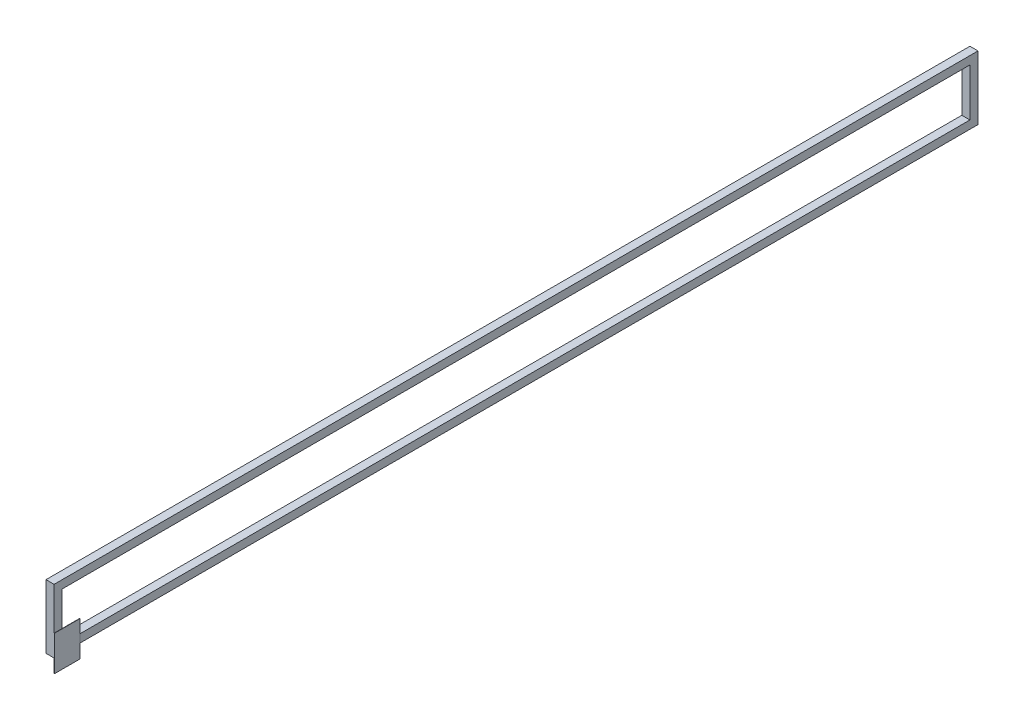
ISO-10303-21;
HEADER;
FILE_DESCRIPTION(('STEP AP214'),'2;1');
FILE_NAME('part.step','',(''),(''),'','','');
FILE_SCHEMA(('AUTOMOTIVE_DESIGN { 1 0 10303 214 1 1 1 1 }'));
ENDSEC;
DATA;
#1=APPLICATION_CONTEXT('core data for automotive mechanical design processes');
#2=APPLICATION_PROTOCOL_DEFINITION('international standard','automotive_design',2000,#1);
#3=PRODUCT_CONTEXT('',#1,'mechanical');
#4=PRODUCT('Part','Part','',(#3));
#5=PRODUCT_RELATED_PRODUCT_CATEGORY('part','',(#4));
#6=PRODUCT_DEFINITION_FORMATION('','',#4);
#7=PRODUCT_DEFINITION_CONTEXT('part definition',#1,'design');
#8=PRODUCT_DEFINITION('design','',#6,#7);
#9=PRODUCT_DEFINITION_SHAPE('','',#8);
#10=(LENGTH_UNIT() NAMED_UNIT(*) SI_UNIT(.MILLI.,.METRE.));
#11=(NAMED_UNIT(*) PLANE_ANGLE_UNIT() SI_UNIT($,.RADIAN.));
#12=(NAMED_UNIT(*) SI_UNIT($,.STERADIAN.) SOLID_ANGLE_UNIT());
#13=UNCERTAINTY_MEASURE_WITH_UNIT(LENGTH_MEASURE(1.E-05),#10,'distance_accuracy_value','');
#14=(GEOMETRIC_REPRESENTATION_CONTEXT(3) GLOBAL_UNCERTAINTY_ASSIGNED_CONTEXT((#13)) GLOBAL_UNIT_ASSIGNED_CONTEXT((#10,
#11,#12)) REPRESENTATION_CONTEXT('',''));
#15=CARTESIAN_POINT('',(0.,0.,0.));
#16=DIRECTION('',(0.,0.,1.));
#17=DIRECTION('',(1.,0.,0.));
#18=AXIS2_PLACEMENT_3D('',#15,#16,#17);
#19=CARTESIAN_POINT('',(25.4,-25.4,5800.));
#20=DIRECTION('',(-1.,0.,0.));
#21=DIRECTION('',(0.,0.,1.));
#22=AXIS2_PLACEMENT_3D('',#19,#20,#21);
#23=PLANE('',#22);
#24=DIRECTION('',(0.,1.,0.));
#25=VECTOR('',#24,1.);
#26=CARTESIAN_POINT('',(25.4,-110.,5640.));
#27=LINE('',#26,#25);
#28=CARTESIAN_POINT('',(25.4,-25.4,5640.));
#29=VERTEX_POINT('',#28);
#30=CARTESIAN_POINT('',(25.4,25.4,5640.));
#31=VERTEX_POINT('',#30);
#32=EDGE_CURVE('E11',#29,#31,#27,.T.);
#33=ORIENTED_EDGE('',*,*,#32,.F.);
#34=DIRECTION('',(0.,0.,-1.));
#35=VECTOR('',#34,1.);
#36=CARTESIAN_POINT('',(25.4,-25.4,5800.));
#37=LINE('',#36,#35);
#38=CARTESIAN_POINT('',(25.4,-25.4,0.));
#39=VERTEX_POINT('',#38);
#40=EDGE_CURVE('E219',#29,#39,#37,.T.);
#41=ORIENTED_EDGE('',*,*,#40,.T.);
#42=DIRECTION('',(0.,1.,0.));
#43=VECTOR('',#42,1.);
#44=CARTESIAN_POINT('',(25.4,-25.4,0.));
#45=LINE('',#44,#43);
#46=CARTESIAN_POINT('',(25.4,375.4,0.));
#47=VERTEX_POINT('',#46);
#48=EDGE_CURVE('E213',#39,#47,#45,.T.);
#49=ORIENTED_EDGE('',*,*,#48,.T.);
#50=DIRECTION('',(0.,0.,1.));
#51=VECTOR('',#50,1.);
#52=CARTESIAN_POINT('',(25.4,375.4,0.));
#53=LINE('',#52,#51);
#54=CARTESIAN_POINT('',(25.4,375.399999999999,5800.));
#55=VERTEX_POINT('',#54);
#56=EDGE_CURVE('E166',#47,#55,#53,.T.);
#57=ORIENTED_EDGE('',*,*,#56,.T.);
#58=DIRECTION('',(0.,-1.,0.));
#59=VECTOR('',#58,1.);
#60=CARTESIAN_POINT('',(25.4,375.399999999999,5800.));
#61=LINE('',#60,#59);
#62=CARTESIAN_POINT('',(25.4,110.,5800.));
#63=VERTEX_POINT('',#62);
#64=EDGE_CURVE('E169',#55,#63,#61,.T.);
#65=ORIENTED_EDGE('',*,*,#64,.T.);
#66=DIRECTION('',(0.,0.,-1.));
#67=VECTOR('',#66,1.);
#68=CARTESIAN_POINT('',(25.4,110.,5800.));
#69=LINE('',#68,#67);
#70=CARTESIAN_POINT('',(25.4,110.,5749.2));
#71=VERTEX_POINT('',#70);
#72=EDGE_CURVE('E170',#63,#71,#69,.T.);
#73=ORIENTED_EDGE('',*,*,#72,.T.);
#74=DIRECTION('',(0.,1.,0.));
#75=VECTOR('',#74,1.);
#76=CARTESIAN_POINT('',(25.4,25.4,5749.2));
#77=LINE('',#76,#75);
#78=CARTESIAN_POINT('',(25.4,324.599999999999,5749.2));
#79=VERTEX_POINT('',#78);
#80=EDGE_CURVE('E273',#71,#79,#77,.T.);
#81=ORIENTED_EDGE('',*,*,#80,.T.);
#82=DIRECTION('',(0.,0.,-1.));
#83=VECTOR('',#82,1.);
#84=CARTESIAN_POINT('',(25.4,324.599999999999,5800.));
#85=LINE('',#84,#83);
#86=CARTESIAN_POINT('',(25.4,324.599999999999,50.7999999999997));
#87=VERTEX_POINT('',#86);
#88=EDGE_CURVE('E152',#79,#87,#85,.T.);
#89=ORIENTED_EDGE('',*,*,#88,.T.);
#90=DIRECTION('',(0.,-1.,0.));
#91=VECTOR('',#90,1.);
#92=CARTESIAN_POINT('',(25.4,324.599999999999,50.7999999999997));
#93=LINE('',#92,#91);
#94=CARTESIAN_POINT('',(25.4,25.4,50.7999999999997));
#95=VERTEX_POINT('',#94);
#96=EDGE_CURVE('E173',#87,#95,#93,.T.);
#97=ORIENTED_EDGE('',*,*,#96,.T.);
#98=DIRECTION('',(0.,0.,-1.));
#99=VECTOR('',#98,1.);
#100=CARTESIAN_POINT('',(25.4,25.4,5800.));
#101=LINE('',#100,#99);
#102=EDGE_CURVE('E53',#31,#95,#101,.T.);
#103=ORIENTED_EDGE('',*,*,#102,.F.);
#104=EDGE_LOOP('',(#33,#41,#49,#57,#65,#73,#81,#89,#97,#103));
#105=FACE_BOUND('',#104,.T.);
#106=ADVANCED_FACE('F36',(#105),#23,.F.);
#107=CARTESIAN_POINT('',(-25.4,25.4,5800.));
#108=DIRECTION('',(0.,-1.,0.));
#109=DIRECTION('',(0.,0.,-1.));
#110=AXIS2_PLACEMENT_3D('',#107,#108,#109);
#111=PLANE('',#110);
#112=DIRECTION('',(0.,0.,-1.));
#113=VECTOR('',#112,1.);
#114=CARTESIAN_POINT('',(-25.4,25.4,5800.));
#115=LINE('',#114,#113);
#116=CARTESIAN_POINT('',(-25.4,25.4,5749.2));
#117=VERTEX_POINT('',#116);
#118=CARTESIAN_POINT('',(-25.4,25.4,50.8000000000006));
#119=VERTEX_POINT('',#118);
#120=EDGE_CURVE('E61',#117,#119,#115,.T.);
#121=ORIENTED_EDGE('',*,*,#120,.F.);
#122=DIRECTION('',(-1.,0.,0.));
#123=VECTOR('',#122,1.);
#124=CARTESIAN_POINT('',(328.881926974243,25.4,5749.2));
#125=LINE('',#124,#123);
#126=CARTESIAN_POINT('',(25.4000000000001,25.4,5749.2));
#127=VERTEX_POINT('',#126);
#128=EDGE_CURVE('E143',#127,#117,#125,.T.);
#129=ORIENTED_EDGE('',*,*,#128,.F.);
#130=EDGE_CURVE('E39',#127,#31,#101,.T.);
#131=ORIENTED_EDGE('',*,*,#130,.T.);
#132=ORIENTED_EDGE('',*,*,#102,.T.);
#133=DIRECTION('',(1.,0.,0.));
#134=VECTOR('',#133,1.);
#135=CARTESIAN_POINT('',(-5835.95074842308,25.4,50.8000000000002));
#136=LINE('',#135,#134);
#137=EDGE_CURVE('E162',#119,#95,#136,.T.);
#138=ORIENTED_EDGE('',*,*,#137,.F.);
#139=EDGE_LOOP('',(#121,#129,#131,#132,#138));
#140=FACE_BOUND('',#139,.T.);
#141=ADVANCED_FACE('F231',(#140),#111,.F.);
#142=CARTESIAN_POINT('',(-25.4,-25.4,5800.));
#143=DIRECTION('',(1.,0.,0.));
#144=DIRECTION('',(0.,0.,-1.));
#145=AXIS2_PLACEMENT_3D('',#142,#143,#144);
#146=PLANE('',#145);
#147=DIRECTION('',(0.,-1.,0.));
#148=VECTOR('',#147,1.);
#149=CARTESIAN_POINT('',(-25.4,25.4,5749.2));
#150=LINE('',#149,#148);
#151=CARTESIAN_POINT('',(-25.4,324.599999999999,5749.2));
#152=VERTEX_POINT('',#151);
#153=EDGE_CURVE('E136',#152,#117,#150,.T.);
#154=ORIENTED_EDGE('',*,*,#153,.T.);
#155=ORIENTED_EDGE('',*,*,#120,.T.);
#156=DIRECTION('',(0.,1.,0.));
#157=VECTOR('',#156,1.);
#158=CARTESIAN_POINT('',(-25.4000000000003,324.599999999999,50.7999999999997));
#159=LINE('',#158,#157);
#160=CARTESIAN_POINT('',(-25.4000000000003,324.599999999999,50.7999999999997));
#161=VERTEX_POINT('',#160);
#162=EDGE_CURVE('E157',#119,#161,#159,.T.);
#163=ORIENTED_EDGE('',*,*,#162,.T.);
#164=DIRECTION('',(0.,0.,1.));
#165=VECTOR('',#164,1.);
#166=CARTESIAN_POINT('',(-25.4000000000003,324.599999999999,5800.));
#167=LINE('',#166,#165);
#168=EDGE_CURVE('E150',#161,#152,#167,.T.);
#169=ORIENTED_EDGE('',*,*,#168,.T.);
#170=EDGE_LOOP('',(#154,#155,#163,#169));
#171=FACE_BOUND('',#170,.T.);
#172=DIRECTION('',(0.,-1.,0.));
#173=VECTOR('',#172,1.);
#174=CARTESIAN_POINT('',(-25.4,-25.4,0.));
#175=LINE('',#174,#173);
#176=CARTESIAN_POINT('',(-25.4000000000021,375.4,0.));
#177=VERTEX_POINT('',#176);
#178=CARTESIAN_POINT('',(-25.4,-25.4,0.));
#179=VERTEX_POINT('',#178);
#180=EDGE_CURVE('E221',#177,#179,#175,.T.);
#181=ORIENTED_EDGE('',*,*,#180,.T.);
#182=DIRECTION('',(0.,0.,-1.));
#183=VECTOR('',#182,1.);
#184=CARTESIAN_POINT('',(-25.4,-25.4,5800.));
#185=LINE('',#184,#183);
#186=CARTESIAN_POINT('',(-25.4,-25.4,5800.));
#187=VERTEX_POINT('',#186);
#188=EDGE_CURVE('E228',#187,#179,#185,.T.);
#189=ORIENTED_EDGE('',*,*,#188,.F.);
#190=DIRECTION('',(0.,-1.,0.));
#191=VECTOR('',#190,1.);
#192=CARTESIAN_POINT('',(-25.4,-25.4,5800.));
#193=LINE('',#192,#191);
#194=CARTESIAN_POINT('',(-25.4000000000003,375.399999999999,5800.));
#195=VERTEX_POINT('',#194);
#196=EDGE_CURVE('E214',#195,#187,#193,.T.);
#197=ORIENTED_EDGE('',*,*,#196,.F.);
#198=DIRECTION('',(0.,0.,-1.));
#199=VECTOR('',#198,1.);
#200=CARTESIAN_POINT('',(-25.4000000000003,375.4,0.));
#201=LINE('',#200,#199);
#202=EDGE_CURVE('E158',#195,#177,#201,.T.);
#203=ORIENTED_EDGE('',*,*,#202,.T.);
#204=EDGE_LOOP('',(#181,#189,#197,#203));
#205=FACE_BOUND('',#204,.T.);
#206=ADVANCED_FACE('F154',(#171,#205),#146,.F.);
#207=CARTESIAN_POINT('',(-25.4,-25.4,5800.));
#208=DIRECTION('',(0.,1.,0.));
#209=DIRECTION('',(0.,0.,1.));
#210=AXIS2_PLACEMENT_3D('',#207,#208,#209);
#211=PLANE('',#210);
#212=DIRECTION('',(1.,0.,0.));
#213=VECTOR('',#212,1.);
#214=CARTESIAN_POINT('',(-25.4,-25.4,0.));
#215=LINE('',#214,#213);
#216=EDGE_CURVE('E217',#179,#39,#215,.T.);
#217=ORIENTED_EDGE('',*,*,#216,.T.);
#218=ORIENTED_EDGE('',*,*,#40,.F.);
#219=CARTESIAN_POINT('',(25.4,-25.4,5800.));
#220=VERTEX_POINT('',#219);
#221=EDGE_CURVE('E225',#220,#29,#37,.T.);
#222=ORIENTED_EDGE('',*,*,#221,.F.);
#223=DIRECTION('',(1.,0.,0.));
#224=VECTOR('',#223,1.);
#225=CARTESIAN_POINT('',(-25.4,-25.4,5800.));
#226=LINE('',#225,#224);
#227=EDGE_CURVE('E216',#187,#220,#226,.T.);
#228=ORIENTED_EDGE('',*,*,#227,.F.);
#229=ORIENTED_EDGE('',*,*,#188,.T.);
#230=EDGE_LOOP('',(#217,#218,#222,#228,#229));
#231=FACE_BOUND('',#230,.T.);
#232=ADVANCED_FACE('F253',(#231),#211,.F.);
#233=CARTESIAN_POINT('',(0.,0.,5800.));
#234=DIRECTION('',(0.,0.,-1.));
#235=DIRECTION('',(-1.,0.,0.));
#236=AXIS2_PLACEMENT_3D('',#233,#234,#235);
#237=PLANE('',#236);
#238=DIRECTION('',(1.,0.,0.));
#239=VECTOR('',#238,1.);
#240=CARTESIAN_POINT('',(-5835.95074842308,375.399999999999,5800.));
#241=LINE('',#240,#239);
#242=EDGE_CURVE('E180',#195,#55,#241,.T.);
#243=ORIENTED_EDGE('',*,*,#242,.F.);
#244=ORIENTED_EDGE('',*,*,#196,.T.);
#245=ORIENTED_EDGE('',*,*,#227,.T.);
#246=DIRECTION('',(0.,-1.,0.));
#247=VECTOR('',#246,1.);
#248=CARTESIAN_POINT('',(25.4,-110.,5800.));
#249=LINE('',#248,#247);
#250=CARTESIAN_POINT('',(25.4,-110.,5800.));
#251=VERTEX_POINT('',#250);
#252=EDGE_CURVE('E199',#220,#251,#249,.T.);
#253=ORIENTED_EDGE('',*,*,#252,.T.);
#254=DIRECTION('',(-1.,0.,0.));
#255=VECTOR('',#254,1.);
#256=CARTESIAN_POINT('',(27.3,-110.,5800.));
#257=LINE('',#256,#255);
#258=CARTESIAN_POINT('',(27.3,-110.,5800.));
#259=VERTEX_POINT('',#258);
#260=EDGE_CURVE('E204',#259,#251,#257,.T.);
#261=ORIENTED_EDGE('',*,*,#260,.F.);
#262=DIRECTION('',(0.,-1.,0.));
#263=VECTOR('',#262,1.);
#264=CARTESIAN_POINT('',(27.3,-110.,5800.));
#265=LINE('',#264,#263);
#266=CARTESIAN_POINT('',(27.3,110.,5800.));
#267=VERTEX_POINT('',#266);
#268=EDGE_CURVE('E190',#267,#259,#265,.T.);
#269=ORIENTED_EDGE('',*,*,#268,.F.);
#270=DIRECTION('',(-1.,0.,0.));
#271=VECTOR('',#270,1.);
#272=CARTESIAN_POINT('',(27.3,110.,5800.));
#273=LINE('',#272,#271);
#274=EDGE_CURVE('E207',#267,#63,#273,.T.);
#275=ORIENTED_EDGE('',*,*,#274,.T.);
#276=ORIENTED_EDGE('',*,*,#64,.F.);
#277=EDGE_LOOP('',(#243,#244,#245,#253,#261,#269,#275,#276));
#278=FACE_BOUND('',#277,.T.);
#279=ADVANCED_FACE('F266',(#278),#237,.F.);
#280=CARTESIAN_POINT('',(0.,0.,0.));
#281=DIRECTION('',(0.,0.,-1.));
#282=DIRECTION('',(-1.,0.,0.));
#283=AXIS2_PLACEMENT_3D('',#280,#281,#282);
#284=PLANE('',#283);
#285=ORIENTED_EDGE('',*,*,#48,.F.);
#286=ORIENTED_EDGE('',*,*,#216,.F.);
#287=ORIENTED_EDGE('',*,*,#180,.F.);
#288=DIRECTION('',(1.,0.,0.));
#289=VECTOR('',#288,1.);
#290=CARTESIAN_POINT('',(-5835.95074842308,375.4,0.));
#291=LINE('',#290,#289);
#292=EDGE_CURVE('E176',#177,#47,#291,.T.);
#293=ORIENTED_EDGE('',*,*,#292,.T.);
#294=EDGE_LOOP('',(#285,#286,#287,#293));
#295=FACE_BOUND('',#294,.T.);
#296=ADVANCED_FACE('F259',(#295),#284,.T.);
#297=CARTESIAN_POINT('',(25.4,0.,0.));
#298=DIRECTION('',(-1.,0.,0.));
#299=DIRECTION('',(0.,0.,1.));
#300=AXIS2_PLACEMENT_3D('',#297,#298,#299);
#301=PLANE('',#300);
#302=EDGE_CURVE('E272',#127,#71,#77,.T.);
#303=ORIENTED_EDGE('',*,*,#302,.T.);
#304=DIRECTION('',(0.,0.,1.));
#305=VECTOR('',#304,1.);
#306=CARTESIAN_POINT('',(25.4,110.,5800.));
#307=LINE('',#306,#305);
#308=CARTESIAN_POINT('',(25.4,110.,5640.));
#309=VERTEX_POINT('',#308);
#310=EDGE_CURVE('E196',#309,#71,#307,.T.);
#311=ORIENTED_EDGE('',*,*,#310,.F.);
#312=EDGE_CURVE('E46',#31,#309,#27,.T.);
#313=ORIENTED_EDGE('',*,*,#312,.F.);
#314=ORIENTED_EDGE('',*,*,#130,.F.);
#315=EDGE_LOOP('',(#303,#311,#313,#314));
#316=FACE_BOUND('',#315,.T.);
#317=ADVANCED_FACE('F239',(#316),#301,.T.);
#318=CARTESIAN_POINT('',(27.3,-110.,5640.));
#319=DIRECTION('',(0.,0.,1.));
#320=DIRECTION('',(1.,0.,0.));
#321=AXIS2_PLACEMENT_3D('',#318,#319,#320);
#322=PLANE('',#321);
#323=CARTESIAN_POINT('',(25.4,-110.,5640.));
#324=VERTEX_POINT('',#323);
#325=EDGE_CURVE('E45',#324,#29,#27,.T.);
#326=ORIENTED_EDGE('',*,*,#325,.T.);
#327=ORIENTED_EDGE('',*,*,#32,.T.);
#328=ORIENTED_EDGE('',*,*,#312,.T.);
#329=DIRECTION('',(-1.,0.,0.));
#330=VECTOR('',#329,1.);
#331=CARTESIAN_POINT('',(27.3,110.,5640.));
#332=LINE('',#331,#330);
#333=CARTESIAN_POINT('',(27.3,110.,5640.));
#334=VERTEX_POINT('',#333);
#335=EDGE_CURVE('E210',#334,#309,#332,.T.);
#336=ORIENTED_EDGE('',*,*,#335,.F.);
#337=DIRECTION('',(0.,1.,0.));
#338=VECTOR('',#337,1.);
#339=CARTESIAN_POINT('',(27.3,-110.,5640.));
#340=LINE('',#339,#338);
#341=CARTESIAN_POINT('',(27.3,-110.,5640.));
#342=VERTEX_POINT('',#341);
#343=EDGE_CURVE('E184',#342,#334,#340,.T.);
#344=ORIENTED_EDGE('',*,*,#343,.F.);
#345=DIRECTION('',(-1.,0.,0.));
#346=VECTOR('',#345,1.);
#347=CARTESIAN_POINT('',(27.3,-110.,5640.));
#348=LINE('',#347,#346);
#349=EDGE_CURVE('E193',#342,#324,#348,.T.);
#350=ORIENTED_EDGE('',*,*,#349,.T.);
#351=EDGE_LOOP('',(#326,#327,#328,#336,#344,#350));
#352=FACE_BOUND('',#351,.T.);
#353=ADVANCED_FACE('F242',(#352),#322,.F.);
#354=CARTESIAN_POINT('',(27.3,110.,5800.));
#355=DIRECTION('',(0.,-1.,0.));
#356=DIRECTION('',(0.,0.,-1.));
#357=AXIS2_PLACEMENT_3D('',#354,#355,#356);
#358=PLANE('',#357);
#359=ORIENTED_EDGE('',*,*,#310,.T.);
#360=ORIENTED_EDGE('',*,*,#72,.F.);
#361=ORIENTED_EDGE('',*,*,#274,.F.);
#362=DIRECTION('',(0.,0.,1.));
#363=VECTOR('',#362,1.);
#364=CARTESIAN_POINT('',(27.3,110.,5800.));
#365=LINE('',#364,#363);
#366=EDGE_CURVE('E187',#334,#267,#365,.T.);
#367=ORIENTED_EDGE('',*,*,#366,.F.);
#368=ORIENTED_EDGE('',*,*,#335,.T.);
#369=EDGE_LOOP('',(#359,#360,#361,#367,#368));
#370=FACE_BOUND('',#369,.T.);
#371=ADVANCED_FACE('F271',(#370),#358,.F.);
#372=CARTESIAN_POINT('',(27.3,-110.,5800.));
#373=DIRECTION('',(0.,1.,0.));
#374=DIRECTION('',(0.,0.,1.));
#375=AXIS2_PLACEMENT_3D('',#372,#373,#374);
#376=PLANE('',#375);
#377=DIRECTION('',(0.,0.,-1.));
#378=VECTOR('',#377,1.);
#379=CARTESIAN_POINT('',(25.4,-110.,5800.));
#380=LINE('',#379,#378);
#381=EDGE_CURVE('E188',#251,#324,#380,.T.);
#382=ORIENTED_EDGE('',*,*,#381,.T.);
#383=ORIENTED_EDGE('',*,*,#349,.F.);
#384=DIRECTION('',(0.,0.,-1.));
#385=VECTOR('',#384,1.);
#386=CARTESIAN_POINT('',(27.3,-110.,5800.));
#387=LINE('',#386,#385);
#388=EDGE_CURVE('E192',#259,#342,#387,.T.);
#389=ORIENTED_EDGE('',*,*,#388,.F.);
#390=ORIENTED_EDGE('',*,*,#260,.T.);
#391=EDGE_LOOP('',(#382,#383,#389,#390));
#392=FACE_BOUND('',#391,.T.);
#393=ADVANCED_FACE('F307',(#392),#376,.F.);
#394=CARTESIAN_POINT('',(27.3,0.,0.));
#395=DIRECTION('',(-1.,0.,0.));
#396=DIRECTION('',(0.,0.,1.));
#397=AXIS2_PLACEMENT_3D('',#394,#395,#396);
#398=PLANE('',#397);
#399=ORIENTED_EDGE('',*,*,#343,.T.);
#400=ORIENTED_EDGE('',*,*,#366,.T.);
#401=ORIENTED_EDGE('',*,*,#268,.T.);
#402=ORIENTED_EDGE('',*,*,#388,.T.);
#403=EDGE_LOOP('',(#399,#400,#401,#402));
#404=FACE_BOUND('',#403,.T.);
#405=ADVANCED_FACE('F285',(#404),#398,.F.);
#406=ORIENTED_EDGE('',*,*,#252,.F.);
#407=ORIENTED_EDGE('',*,*,#221,.T.);
#408=ORIENTED_EDGE('',*,*,#325,.F.);
#409=ORIENTED_EDGE('',*,*,#381,.F.);
#410=EDGE_LOOP('',(#406,#407,#408,#409));
#411=FACE_BOUND('',#410,.T.);
#412=ADVANCED_FACE('F249',(#411),#301,.T.);
#413=CARTESIAN_POINT('',(-5835.95074842308,324.599999999999,50.7999999999997));
#414=DIRECTION('',(0.,0.,1.));
#415=DIRECTION('',(0.,-1.,0.));
#416=AXIS2_PLACEMENT_3D('',#413,#414,#415);
#417=PLANE('',#416);
#418=ORIENTED_EDGE('',*,*,#162,.F.);
#419=ORIENTED_EDGE('',*,*,#137,.T.);
#420=ORIENTED_EDGE('',*,*,#96,.F.);
#421=DIRECTION('',(1.,0.,0.));
#422=VECTOR('',#421,1.);
#423=CARTESIAN_POINT('',(-5835.95074842308,324.599999999999,50.7999999999997));
#424=LINE('',#423,#422);
#425=EDGE_CURVE('E178',#161,#87,#424,.T.);
#426=ORIENTED_EDGE('',*,*,#425,.F.);
#427=EDGE_LOOP('',(#418,#419,#420,#426));
#428=FACE_BOUND('',#427,.T.);
#429=ADVANCED_FACE('F277',(#428),#417,.T.);
#430=CARTESIAN_POINT('',(-5835.95074842308,324.599999999999,5800.));
#431=DIRECTION('',(0.,-1.,0.));
#432=DIRECTION('',(0.,0.,-1.));
#433=AXIS2_PLACEMENT_3D('',#430,#431,#432);
#434=PLANE('',#433);
#435=DIRECTION('',(-1.,0.,0.));
#436=VECTOR('',#435,1.);
#437=CARTESIAN_POINT('',(328.881926974243,324.599999999999,5749.2));
#438=LINE('',#437,#436);
#439=EDGE_CURVE('E140',#79,#152,#438,.T.);
#440=ORIENTED_EDGE('',*,*,#439,.T.);
#441=ORIENTED_EDGE('',*,*,#168,.F.);
#442=ORIENTED_EDGE('',*,*,#425,.T.);
#443=ORIENTED_EDGE('',*,*,#88,.F.);
#444=EDGE_LOOP('',(#440,#441,#442,#443));
#445=FACE_BOUND('',#444,.T.);
#446=ADVANCED_FACE('F148',(#445),#434,.T.);
#447=CARTESIAN_POINT('',(-5835.95074842308,375.4,0.));
#448=DIRECTION('',(0.,1.,0.));
#449=DIRECTION('',(0.,0.,1.));
#450=AXIS2_PLACEMENT_3D('',#447,#448,#449);
#451=PLANE('',#450);
#452=ORIENTED_EDGE('',*,*,#202,.F.);
#453=ORIENTED_EDGE('',*,*,#242,.T.);
#454=ORIENTED_EDGE('',*,*,#56,.F.);
#455=ORIENTED_EDGE('',*,*,#292,.F.);
#456=EDGE_LOOP('',(#452,#453,#454,#455));
#457=FACE_BOUND('',#456,.T.);
#458=ADVANCED_FACE('F262',(#457),#451,.T.);
#459=CARTESIAN_POINT('',(328.881926974243,25.4,5749.2));
#460=DIRECTION('',(0.,0.,-1.));
#461=DIRECTION('',(-1.,0.,0.));
#462=AXIS2_PLACEMENT_3D('',#459,#460,#461);
#463=PLANE('',#462);
#464=ORIENTED_EDGE('',*,*,#302,.F.);
#465=ORIENTED_EDGE('',*,*,#128,.T.);
#466=ORIENTED_EDGE('',*,*,#153,.F.);
#467=ORIENTED_EDGE('',*,*,#439,.F.);
#468=ORIENTED_EDGE('',*,*,#80,.F.);
#469=EDGE_LOOP('',(#464,#465,#466,#467,#468));
#470=FACE_BOUND('',#469,.T.);
#471=ADVANCED_FACE('F138',(#470),#463,.T.);
#472=CLOSED_SHELL('',(#106,#141,#206,#232,#279,#296,#317,#353,#371,#393,#405,#412,#429,#446,
#458,#471));
#473=MANIFOLD_SOLID_BREP('B2',#472);
#474=ADVANCED_BREP_SHAPE_REPRESENTATION('',(#18,#473),#14);
#475=SHAPE_DEFINITION_REPRESENTATION(#9,#474);
ENDSEC;
END-ISO-10303-21;
